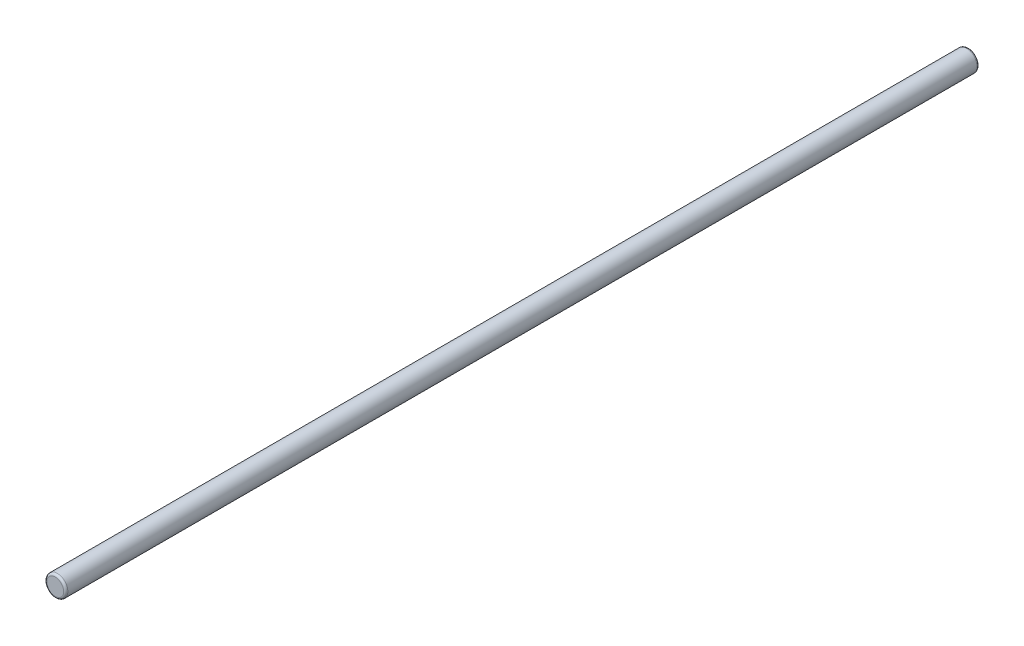
ISO-10303-21;
HEADER;
FILE_DESCRIPTION(('STEP AP214'),'2;1');
FILE_NAME('part.step','',(''),(''),'','','');
FILE_SCHEMA(('AUTOMOTIVE_DESIGN { 1 0 10303 214 1 1 1 1 }'));
ENDSEC;
DATA;
#1=APPLICATION_CONTEXT('core data for automotive mechanical design processes');
#2=APPLICATION_PROTOCOL_DEFINITION('international standard','automotive_design',2000,#1);
#3=PRODUCT_CONTEXT('',#1,'mechanical');
#4=PRODUCT('Part','Part','',(#3));
#5=PRODUCT_RELATED_PRODUCT_CATEGORY('part','',(#4));
#6=PRODUCT_DEFINITION_FORMATION('','',#4);
#7=PRODUCT_DEFINITION_CONTEXT('part definition',#1,'design');
#8=PRODUCT_DEFINITION('design','',#6,#7);
#9=PRODUCT_DEFINITION_SHAPE('','',#8);
#10=(LENGTH_UNIT() NAMED_UNIT(*) SI_UNIT(.MILLI.,.METRE.));
#11=(NAMED_UNIT(*) PLANE_ANGLE_UNIT() SI_UNIT($,.RADIAN.));
#12=(NAMED_UNIT(*) SI_UNIT($,.STERADIAN.) SOLID_ANGLE_UNIT());
#13=UNCERTAINTY_MEASURE_WITH_UNIT(LENGTH_MEASURE(1.E-05),#10,'distance_accuracy_value','');
#14=(GEOMETRIC_REPRESENTATION_CONTEXT(3) GLOBAL_UNCERTAINTY_ASSIGNED_CONTEXT((#13)) GLOBAL_UNIT_ASSIGNED_CONTEXT((#10,
#11,#12)) REPRESENTATION_CONTEXT('',''));
#15=CARTESIAN_POINT('',(0.,0.,0.));
#16=DIRECTION('',(0.,0.,1.));
#17=DIRECTION('',(1.,0.,0.));
#18=AXIS2_PLACEMENT_3D('',#15,#16,#17);
#19=CARTESIAN_POINT('',(0.,0.,0.));
#20=DIRECTION('',(0.,0.,-1.));
#21=DIRECTION('',(-1.,0.,0.));
#22=AXIS2_PLACEMENT_3D('',#19,#20,#21);
#23=PLANE('',#22);
#24=CARTESIAN_POINT('',(0.,0.,0.));
#25=DIRECTION('',(0.,0.,-1.));
#26=DIRECTION('',(-1.,0.,0.));
#27=AXIS2_PLACEMENT_3D('',#24,#25,#26);
#28=CIRCLE('',#27,0.8);
#29=CARTESIAN_POINT('',(-0.8,0.,0.));
#30=VERTEX_POINT('',#29);
#31=EDGE_CURVE('E47',#30,#30,#28,.F.);
#32=ORIENTED_EDGE('',*,*,#31,.T.);
#33=EDGE_LOOP('',(#32));
#34=FACE_BOUND('',#33,.T.);
#35=ADVANCED_FACE('F39',(#34),#23,.F.);
#36=CARTESIAN_POINT('',(0.,0.,0.));
#37=DIRECTION('',(0.,0.,1.));
#38=DIRECTION('',(1.,0.,0.));
#39=AXIS2_PLACEMENT_3D('',#36,#37,#38);
#40=CYLINDRICAL_SURFACE('',#39,1.);
#41=CARTESIAN_POINT('',(0.,0.,-0.2));
#42=DIRECTION('',(0.,0.,-1.));
#43=DIRECTION('',(-1.,0.,0.));
#44=AXIS2_PLACEMENT_3D('',#41,#42,#43);
#45=CIRCLE('',#44,1.);
#46=CARTESIAN_POINT('',(-1.,0.,-0.2));
#47=VERTEX_POINT('',#46);
#48=EDGE_CURVE('E10',#47,#47,#45,.T.);
#49=ORIENTED_EDGE('',*,*,#48,.T.);
#50=EDGE_LOOP('',(#49));
#51=FACE_BOUND('',#50,.T.);
#52=CARTESIAN_POINT('',(0.,0.,-86.8));
#53=DIRECTION('',(0.,0.,1.));
#54=DIRECTION('',(1.,0.,0.));
#55=AXIS2_PLACEMENT_3D('',#52,#53,#54);
#56=CIRCLE('',#55,1.);
#57=CARTESIAN_POINT('',(1.,0.,-86.8));
#58=VERTEX_POINT('',#57);
#59=EDGE_CURVE('E57',#58,#58,#56,.T.);
#60=ORIENTED_EDGE('',*,*,#59,.T.);
#61=EDGE_LOOP('',(#60));
#62=FACE_BOUND('',#61,.T.);
#63=ADVANCED_FACE('F64',(#51,#62),#40,.T.);
#64=CARTESIAN_POINT('',(0.,1.,-87.));
#65=DIRECTION('',(0.,0.,1.));
#66=DIRECTION('',(1.,0.,0.));
#67=AXIS2_PLACEMENT_3D('',#64,#65,#66);
#68=PLANE('',#67);
#69=CARTESIAN_POINT('',(0.,0.,-87.));
#70=DIRECTION('',(0.,0.,1.));
#71=DIRECTION('',(1.,0.,0.));
#72=AXIS2_PLACEMENT_3D('',#69,#70,#71);
#73=CIRCLE('',#72,0.8);
#74=CARTESIAN_POINT('',(0.8,0.,-87.));
#75=VERTEX_POINT('',#74);
#76=EDGE_CURVE('E52',#75,#75,#73,.F.);
#77=ORIENTED_EDGE('',*,*,#76,.T.);
#78=EDGE_LOOP('',(#77));
#79=FACE_BOUND('',#78,.T.);
#80=ADVANCED_FACE('F68',(#79),#68,.F.);
#81=CARTESIAN_POINT('',(0.,0.,-86.8));
#82=DIRECTION('',(0.,0.,1.));
#83=DIRECTION('',(1.,0.,0.));
#84=AXIS2_PLACEMENT_3D('',#81,#82,#83);
#85=TOROIDAL_SURFACE('',#84,0.8,0.2);
#86=ORIENTED_EDGE('',*,*,#76,.F.);
#87=EDGE_LOOP('',(#86));
#88=FACE_BOUND('',#87,.T.);
#89=ORIENTED_EDGE('',*,*,#59,.F.);
#90=EDGE_LOOP('',(#89));
#91=FACE_BOUND('',#90,.T.);
#92=ADVANCED_FACE('F66',(#88,#91),#85,.T.);
#93=CARTESIAN_POINT('',(0.,0.,-0.2));
#94=DIRECTION('',(0.,0.,-1.));
#95=DIRECTION('',(-1.,0.,0.));
#96=AXIS2_PLACEMENT_3D('',#93,#94,#95);
#97=TOROIDAL_SURFACE('',#96,0.8,0.2);
#98=ORIENTED_EDGE('',*,*,#48,.F.);
#99=EDGE_LOOP('',(#98));
#100=FACE_BOUND('',#99,.T.);
#101=ORIENTED_EDGE('',*,*,#31,.F.);
#102=EDGE_LOOP('',(#101));
#103=FACE_BOUND('',#102,.T.);
#104=ADVANCED_FACE('F41',(#100,#103),#97,.T.);
#105=CLOSED_SHELL('',(#35,#63,#80,#92,#104));
#106=MANIFOLD_SOLID_BREP('B2',#105);
#107=ADVANCED_BREP_SHAPE_REPRESENTATION('',(#18,#106),#14);
#108=SHAPE_DEFINITION_REPRESENTATION(#9,#107);
ENDSEC;
END-ISO-10303-21;
